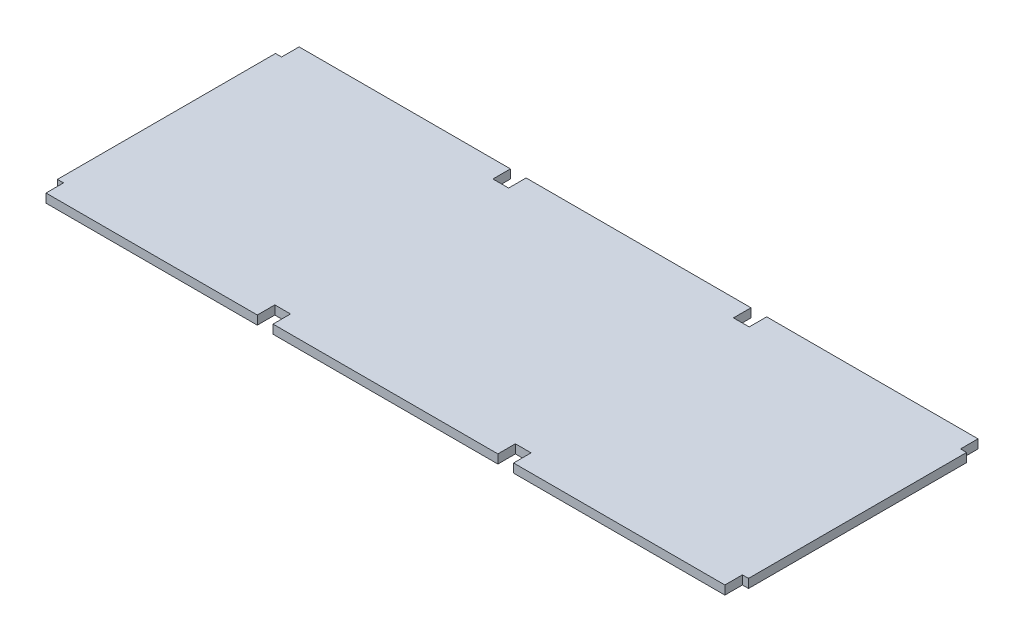
ISO-10303-21;
HEADER;
FILE_DESCRIPTION(('STEP AP214'),'2;1');
FILE_NAME('part.step','',(''),(''),'','','');
FILE_SCHEMA(('AUTOMOTIVE_DESIGN { 1 0 10303 214 1 1 1 1 }'));
ENDSEC;
DATA;
#1=APPLICATION_CONTEXT('core data for automotive mechanical design processes');
#2=APPLICATION_PROTOCOL_DEFINITION('international standard','automotive_design',2000,#1);
#3=PRODUCT_CONTEXT('',#1,'mechanical');
#4=PRODUCT('Part','Part','',(#3));
#5=PRODUCT_RELATED_PRODUCT_CATEGORY('part','',(#4));
#6=PRODUCT_DEFINITION_FORMATION('','',#4);
#7=PRODUCT_DEFINITION_CONTEXT('part definition',#1,'design');
#8=PRODUCT_DEFINITION('design','',#6,#7);
#9=PRODUCT_DEFINITION_SHAPE('','',#8);
#10=(LENGTH_UNIT() NAMED_UNIT(*) SI_UNIT(.MILLI.,.METRE.));
#11=(NAMED_UNIT(*) PLANE_ANGLE_UNIT() SI_UNIT($,.RADIAN.));
#12=(NAMED_UNIT(*) SI_UNIT($,.STERADIAN.) SOLID_ANGLE_UNIT());
#13=UNCERTAINTY_MEASURE_WITH_UNIT(LENGTH_MEASURE(1.E-05),#10,'distance_accuracy_value','');
#14=(GEOMETRIC_REPRESENTATION_CONTEXT(3) GLOBAL_UNCERTAINTY_ASSIGNED_CONTEXT((#13)) GLOBAL_UNIT_ASSIGNED_CONTEXT((#10,
#11,#12)) REPRESENTATION_CONTEXT('',''));
#15=CARTESIAN_POINT('',(0.,0.,0.));
#16=DIRECTION('',(0.,0.,1.));
#17=DIRECTION('',(1.,0.,0.));
#18=AXIS2_PLACEMENT_3D('',#15,#16,#17);
#19=CARTESIAN_POINT('',(2.7,3.9,0.));
#20=DIRECTION('',(0.,0.,-1.));
#21=DIRECTION('',(-1.,0.,0.));
#22=AXIS2_PLACEMENT_3D('',#19,#20,#21);
#23=PLANE('',#22);
#24=DIRECTION('',(1.,0.,0.));
#25=VECTOR('',#24,1.);
#26=CARTESIAN_POINT('',(2.7,0.,0.));
#27=LINE('',#26,#25);
#28=CARTESIAN_POINT('',(0.,0.,0.));
#29=VERTEX_POINT('',#28);
#30=CARTESIAN_POINT('',(2.7,0.,0.));
#31=VERTEX_POINT('',#30);
#32=EDGE_CURVE('E253',#29,#31,#27,.T.);
#33=ORIENTED_EDGE('',*,*,#32,.T.);
#34=DIRECTION('',(0.,-1.,0.));
#35=VECTOR('',#34,1.);
#36=CARTESIAN_POINT('',(2.7,3.9,0.));
#37=LINE('',#36,#35);
#38=CARTESIAN_POINT('',(2.7,3.9,0.));
#39=VERTEX_POINT('',#38);
#40=EDGE_CURVE('E11',#39,#31,#37,.T.);
#41=ORIENTED_EDGE('',*,*,#40,.F.);
#42=DIRECTION('',(1.,0.,0.));
#43=VECTOR('',#42,1.);
#44=CARTESIAN_POINT('',(2.7,3.9,0.));
#45=LINE('',#44,#43);
#46=CARTESIAN_POINT('',(0.,3.9,0.));
#47=VERTEX_POINT('',#46);
#48=EDGE_CURVE('E307',#47,#39,#45,.T.);
#49=ORIENTED_EDGE('',*,*,#48,.F.);
#50=DIRECTION('',(0.,-1.,0.));
#51=VECTOR('',#50,1.);
#52=CARTESIAN_POINT('',(0.,3.9,0.));
#53=LINE('',#52,#51);
#54=EDGE_CURVE('E249',#47,#29,#53,.T.);
#55=ORIENTED_EDGE('',*,*,#54,.T.);
#56=EDGE_LOOP('',(#33,#41,#49,#55));
#57=FACE_BOUND('',#56,.T.);
#58=ADVANCED_FACE('F37',(#57),#23,.F.);
#59=CARTESIAN_POINT('',(2.69999999999999,3.9,7.75000000000001));
#60=DIRECTION('',(1.,0.,0.));
#61=DIRECTION('',(0.,0.,-1.));
#62=AXIS2_PLACEMENT_3D('',#59,#60,#61);
#63=PLANE('',#62);
#64=DIRECTION('',(0.,0.,1.));
#65=VECTOR('',#64,1.);
#66=CARTESIAN_POINT('',(2.69999999999999,0.,7.75000000000001));
#67=LINE('',#66,#65);
#68=CARTESIAN_POINT('',(2.69999999999999,0.,7.75000000000001));
#69=VERTEX_POINT('',#68);
#70=EDGE_CURVE('E256',#31,#69,#67,.T.);
#71=ORIENTED_EDGE('',*,*,#70,.T.);
#72=DIRECTION('',(0.,-1.,0.));
#73=VECTOR('',#72,1.);
#74=CARTESIAN_POINT('',(2.69999999999999,3.9,7.75000000000001));
#75=LINE('',#74,#73);
#76=CARTESIAN_POINT('',(2.69999999999999,3.9,7.75000000000001));
#77=VERTEX_POINT('',#76);
#78=EDGE_CURVE('E45',#77,#69,#75,.T.);
#79=ORIENTED_EDGE('',*,*,#78,.F.);
#80=DIRECTION('',(0.,0.,1.));
#81=VECTOR('',#80,1.);
#82=CARTESIAN_POINT('',(2.69999999999999,3.9,7.75000000000001));
#83=LINE('',#82,#81);
#84=EDGE_CURVE('E156',#39,#77,#83,.T.);
#85=ORIENTED_EDGE('',*,*,#84,.F.);
#86=ORIENTED_EDGE('',*,*,#40,.T.);
#87=EDGE_LOOP('',(#71,#79,#85,#86));
#88=FACE_BOUND('',#87,.T.);
#89=ADVANCED_FACE('F465',(#88),#63,.F.);
#90=CARTESIAN_POINT('',(96.2,3.9,7.75));
#91=DIRECTION('',(0.,0.,-1.));
#92=DIRECTION('',(-1.,0.,0.));
#93=AXIS2_PLACEMENT_3D('',#90,#91,#92);
#94=PLANE('',#93);
#95=DIRECTION('',(1.,0.,0.));
#96=VECTOR('',#95,1.);
#97=CARTESIAN_POINT('',(96.2,0.,7.75));
#98=LINE('',#97,#96);
#99=CARTESIAN_POINT('',(96.2,0.,7.75));
#100=VERTEX_POINT('',#99);
#101=EDGE_CURVE('E258',#69,#100,#98,.T.);
#102=ORIENTED_EDGE('',*,*,#101,.T.);
#103=DIRECTION('',(0.,-1.,0.));
#104=VECTOR('',#103,1.);
#105=CARTESIAN_POINT('',(96.2,3.9,7.75));
#106=LINE('',#105,#104);
#107=CARTESIAN_POINT('',(96.2,3.9,7.75));
#108=VERTEX_POINT('',#107);
#109=EDGE_CURVE('E374',#108,#100,#106,.T.);
#110=ORIENTED_EDGE('',*,*,#109,.F.);
#111=DIRECTION('',(1.,0.,0.));
#112=VECTOR('',#111,1.);
#113=CARTESIAN_POINT('',(96.2,3.9,7.75));
#114=LINE('',#113,#112);
#115=EDGE_CURVE('E382',#77,#108,#114,.T.);
#116=ORIENTED_EDGE('',*,*,#115,.F.);
#117=ORIENTED_EDGE('',*,*,#78,.T.);
#118=EDGE_LOOP('',(#102,#110,#116,#117));
#119=FACE_BOUND('',#118,.T.);
#120=ADVANCED_FACE('F380',(#119),#94,.F.);
#121=CARTESIAN_POINT('',(96.2,3.9,0.));
#122=DIRECTION('',(-1.,0.,0.));
#123=DIRECTION('',(0.,0.,1.));
#124=AXIS2_PLACEMENT_3D('',#121,#122,#123);
#125=PLANE('',#124);
#126=DIRECTION('',(0.,0.,-1.));
#127=VECTOR('',#126,1.);
#128=CARTESIAN_POINT('',(96.2,0.,0.));
#129=LINE('',#128,#127);
#130=CARTESIAN_POINT('',(96.2,0.,0.));
#131=VERTEX_POINT('',#130);
#132=EDGE_CURVE('E260',#100,#131,#129,.T.);
#133=ORIENTED_EDGE('',*,*,#132,.T.);
#134=DIRECTION('',(0.,-1.,0.));
#135=VECTOR('',#134,1.);
#136=CARTESIAN_POINT('',(96.2,3.9,0.));
#137=LINE('',#136,#135);
#138=CARTESIAN_POINT('',(96.2,3.9,0.));
#139=VERTEX_POINT('',#138);
#140=EDGE_CURVE('E371',#139,#131,#137,.T.);
#141=ORIENTED_EDGE('',*,*,#140,.F.);
#142=DIRECTION('',(0.,0.,-1.));
#143=VECTOR('',#142,1.);
#144=CARTESIAN_POINT('',(96.2,3.9,0.));
#145=LINE('',#144,#143);
#146=EDGE_CURVE('E400',#108,#139,#145,.T.);
#147=ORIENTED_EDGE('',*,*,#146,.F.);
#148=ORIENTED_EDGE('',*,*,#109,.T.);
#149=EDGE_LOOP('',(#133,#141,#147,#148));
#150=FACE_BOUND('',#149,.T.);
#151=ADVANCED_FACE('F391',(#150),#125,.F.);
#152=CARTESIAN_POINT('',(103.15,3.9,0.));
#153=DIRECTION('',(0.,0.,-1.));
#154=DIRECTION('',(-1.,0.,0.));
#155=AXIS2_PLACEMENT_3D('',#152,#153,#154);
#156=PLANE('',#155);
#157=DIRECTION('',(1.,0.,0.));
#158=VECTOR('',#157,1.);
#159=CARTESIAN_POINT('',(103.15,0.,0.));
#160=LINE('',#159,#158);
#161=CARTESIAN_POINT('',(103.15,0.,0.));
#162=VERTEX_POINT('',#161);
#163=EDGE_CURVE('E262',#131,#162,#160,.T.);
#164=ORIENTED_EDGE('',*,*,#163,.T.);
#165=DIRECTION('',(0.,-1.,0.));
#166=VECTOR('',#165,1.);
#167=CARTESIAN_POINT('',(103.15,3.9,0.));
#168=LINE('',#167,#166);
#169=CARTESIAN_POINT('',(103.15,3.9,0.));
#170=VERTEX_POINT('',#169);
#171=EDGE_CURVE('E368',#170,#162,#168,.T.);
#172=ORIENTED_EDGE('',*,*,#171,.F.);
#173=DIRECTION('',(1.,0.,0.));
#174=VECTOR('',#173,1.);
#175=CARTESIAN_POINT('',(103.15,3.9,0.));
#176=LINE('',#175,#174);
#177=EDGE_CURVE('E397',#139,#170,#176,.T.);
#178=ORIENTED_EDGE('',*,*,#177,.F.);
#179=ORIENTED_EDGE('',*,*,#140,.T.);
#180=EDGE_LOOP('',(#164,#172,#178,#179));
#181=FACE_BOUND('',#180,.T.);
#182=ADVANCED_FACE('F395',(#181),#156,.F.);
#183=CARTESIAN_POINT('',(103.15,3.9,7.75));
#184=DIRECTION('',(1.,0.,0.));
#185=DIRECTION('',(0.,0.,-1.));
#186=AXIS2_PLACEMENT_3D('',#183,#184,#185);
#187=PLANE('',#186);
#188=DIRECTION('',(0.,0.,1.));
#189=VECTOR('',#188,1.);
#190=CARTESIAN_POINT('',(103.15,0.,7.75));
#191=LINE('',#190,#189);
#192=CARTESIAN_POINT('',(103.15,0.,7.75));
#193=VERTEX_POINT('',#192);
#194=EDGE_CURVE('E264',#162,#193,#191,.T.);
#195=ORIENTED_EDGE('',*,*,#194,.T.);
#196=DIRECTION('',(0.,-1.,0.));
#197=VECTOR('',#196,1.);
#198=CARTESIAN_POINT('',(103.15,3.9,7.75));
#199=LINE('',#198,#197);
#200=CARTESIAN_POINT('',(103.15,3.9,7.75));
#201=VERTEX_POINT('',#200);
#202=EDGE_CURVE('E365',#201,#193,#199,.T.);
#203=ORIENTED_EDGE('',*,*,#202,.F.);
#204=DIRECTION('',(0.,0.,1.));
#205=VECTOR('',#204,1.);
#206=CARTESIAN_POINT('',(103.15,3.9,7.75));
#207=LINE('',#206,#205);
#208=EDGE_CURVE('E399',#170,#201,#207,.T.);
#209=ORIENTED_EDGE('',*,*,#208,.F.);
#210=ORIENTED_EDGE('',*,*,#171,.T.);
#211=EDGE_LOOP('',(#195,#203,#209,#210));
#212=FACE_BOUND('',#211,.T.);
#213=ADVANCED_FACE('F478',(#212),#187,.F.);
#214=CARTESIAN_POINT('',(202.65,3.9,7.74999999999998));
#215=DIRECTION('',(0.,0.,-1.));
#216=DIRECTION('',(-1.,0.,0.));
#217=AXIS2_PLACEMENT_3D('',#214,#215,#216);
#218=PLANE('',#217);
#219=DIRECTION('',(1.,0.,0.));
#220=VECTOR('',#219,1.);
#221=CARTESIAN_POINT('',(202.65,0.,7.74999999999998));
#222=LINE('',#221,#220);
#223=CARTESIAN_POINT('',(202.65,0.,7.74999999999998));
#224=VERTEX_POINT('',#223);
#225=EDGE_CURVE('E266',#193,#224,#222,.T.);
#226=ORIENTED_EDGE('',*,*,#225,.T.);
#227=DIRECTION('',(0.,-1.,0.));
#228=VECTOR('',#227,1.);
#229=CARTESIAN_POINT('',(202.65,3.9,7.74999999999998));
#230=LINE('',#229,#228);
#231=CARTESIAN_POINT('',(202.65,3.9,7.74999999999998));
#232=VERTEX_POINT('',#231);
#233=EDGE_CURVE('E362',#232,#224,#230,.T.);
#234=ORIENTED_EDGE('',*,*,#233,.F.);
#235=DIRECTION('',(1.,0.,0.));
#236=VECTOR('',#235,1.);
#237=CARTESIAN_POINT('',(202.65,3.9,7.74999999999998));
#238=LINE('',#237,#236);
#239=EDGE_CURVE('E402',#201,#232,#238,.T.);
#240=ORIENTED_EDGE('',*,*,#239,.F.);
#241=ORIENTED_EDGE('',*,*,#202,.T.);
#242=EDGE_LOOP('',(#226,#234,#240,#241));
#243=FACE_BOUND('',#242,.T.);
#244=ADVANCED_FACE('F481',(#243),#218,.F.);
#245=CARTESIAN_POINT('',(202.65,3.9,0.));
#246=DIRECTION('',(-1.,0.,0.));
#247=DIRECTION('',(0.,0.,1.));
#248=AXIS2_PLACEMENT_3D('',#245,#246,#247);
#249=PLANE('',#248);
#250=DIRECTION('',(0.,0.,-1.));
#251=VECTOR('',#250,1.);
#252=CARTESIAN_POINT('',(202.65,0.,0.));
#253=LINE('',#252,#251);
#254=CARTESIAN_POINT('',(202.65,0.,0.));
#255=VERTEX_POINT('',#254);
#256=EDGE_CURVE('E268',#224,#255,#253,.T.);
#257=ORIENTED_EDGE('',*,*,#256,.T.);
#258=DIRECTION('',(0.,-1.,0.));
#259=VECTOR('',#258,1.);
#260=CARTESIAN_POINT('',(202.65,3.9,0.));
#261=LINE('',#260,#259);
#262=CARTESIAN_POINT('',(202.65,3.9,0.));
#263=VERTEX_POINT('',#262);
#264=EDGE_CURVE('E359',#263,#255,#261,.T.);
#265=ORIENTED_EDGE('',*,*,#264,.F.);
#266=DIRECTION('',(0.,0.,-1.));
#267=VECTOR('',#266,1.);
#268=CARTESIAN_POINT('',(202.65,3.9,0.));
#269=LINE('',#268,#267);
#270=EDGE_CURVE('E408',#232,#263,#269,.T.);
#271=ORIENTED_EDGE('',*,*,#270,.F.);
#272=ORIENTED_EDGE('',*,*,#233,.T.);
#273=EDGE_LOOP('',(#257,#265,#271,#272));
#274=FACE_BOUND('',#273,.T.);
#275=ADVANCED_FACE('F485',(#274),#249,.F.);
#276=CARTESIAN_POINT('',(209.6,3.9,0.));
#277=DIRECTION('',(0.,0.,-1.));
#278=DIRECTION('',(-1.,0.,0.));
#279=AXIS2_PLACEMENT_3D('',#276,#277,#278);
#280=PLANE('',#279);
#281=DIRECTION('',(1.,0.,0.));
#282=VECTOR('',#281,1.);
#283=CARTESIAN_POINT('',(209.6,0.,0.));
#284=LINE('',#283,#282);
#285=CARTESIAN_POINT('',(209.6,0.,0.));
#286=VERTEX_POINT('',#285);
#287=EDGE_CURVE('E270',#255,#286,#284,.T.);
#288=ORIENTED_EDGE('',*,*,#287,.T.);
#289=DIRECTION('',(0.,-1.,0.));
#290=VECTOR('',#289,1.);
#291=CARTESIAN_POINT('',(209.6,3.9,0.));
#292=LINE('',#291,#290);
#293=CARTESIAN_POINT('',(209.6,3.9,0.));
#294=VERTEX_POINT('',#293);
#295=EDGE_CURVE('E356',#294,#286,#292,.T.);
#296=ORIENTED_EDGE('',*,*,#295,.F.);
#297=DIRECTION('',(1.,0.,0.));
#298=VECTOR('',#297,1.);
#299=CARTESIAN_POINT('',(209.6,3.9,0.));
#300=LINE('',#299,#298);
#301=EDGE_CURVE('E410',#263,#294,#300,.T.);
#302=ORIENTED_EDGE('',*,*,#301,.F.);
#303=ORIENTED_EDGE('',*,*,#264,.T.);
#304=EDGE_LOOP('',(#288,#296,#302,#303));
#305=FACE_BOUND('',#304,.T.);
#306=ADVANCED_FACE('F489',(#305),#280,.F.);
#307=CARTESIAN_POINT('',(209.6,3.9,7.75));
#308=DIRECTION('',(1.,0.,0.));
#309=DIRECTION('',(0.,0.,-1.));
#310=AXIS2_PLACEMENT_3D('',#307,#308,#309);
#311=PLANE('',#310);
#312=DIRECTION('',(0.,0.,1.));
#313=VECTOR('',#312,1.);
#314=CARTESIAN_POINT('',(209.6,0.,7.75));
#315=LINE('',#314,#313);
#316=CARTESIAN_POINT('',(209.6,0.,7.75));
#317=VERTEX_POINT('',#316);
#318=EDGE_CURVE('E272',#286,#317,#315,.T.);
#319=ORIENTED_EDGE('',*,*,#318,.T.);
#320=DIRECTION('',(0.,-1.,0.));
#321=VECTOR('',#320,1.);
#322=CARTESIAN_POINT('',(209.6,3.9,7.75));
#323=LINE('',#322,#321);
#324=CARTESIAN_POINT('',(209.6,3.9,7.75));
#325=VERTEX_POINT('',#324);
#326=EDGE_CURVE('E353',#325,#317,#323,.T.);
#327=ORIENTED_EDGE('',*,*,#326,.F.);
#328=DIRECTION('',(0.,0.,1.));
#329=VECTOR('',#328,1.);
#330=CARTESIAN_POINT('',(209.6,3.9,7.75));
#331=LINE('',#330,#329);
#332=EDGE_CURVE('E412',#294,#325,#331,.T.);
#333=ORIENTED_EDGE('',*,*,#332,.F.);
#334=ORIENTED_EDGE('',*,*,#295,.T.);
#335=EDGE_LOOP('',(#319,#327,#333,#334));
#336=FACE_BOUND('',#335,.T.);
#337=ADVANCED_FACE('F493',(#336),#311,.F.);
#338=CARTESIAN_POINT('',(303.1,3.9,7.75));
#339=DIRECTION('',(0.,0.,-1.));
#340=DIRECTION('',(-1.,0.,0.));
#341=AXIS2_PLACEMENT_3D('',#338,#339,#340);
#342=PLANE('',#341);
#343=DIRECTION('',(1.,0.,0.));
#344=VECTOR('',#343,1.);
#345=CARTESIAN_POINT('',(303.1,0.,7.75));
#346=LINE('',#345,#344);
#347=CARTESIAN_POINT('',(303.1,0.,7.75));
#348=VERTEX_POINT('',#347);
#349=EDGE_CURVE('E274',#317,#348,#346,.T.);
#350=ORIENTED_EDGE('',*,*,#349,.T.);
#351=DIRECTION('',(0.,-1.,0.));
#352=VECTOR('',#351,1.);
#353=CARTESIAN_POINT('',(303.1,3.9,7.75));
#354=LINE('',#353,#352);
#355=CARTESIAN_POINT('',(303.1,3.9,7.75));
#356=VERTEX_POINT('',#355);
#357=EDGE_CURVE('E350',#356,#348,#354,.T.);
#358=ORIENTED_EDGE('',*,*,#357,.F.);
#359=DIRECTION('',(1.,0.,0.));
#360=VECTOR('',#359,1.);
#361=CARTESIAN_POINT('',(303.1,3.9,7.75));
#362=LINE('',#361,#360);
#363=EDGE_CURVE('E414',#325,#356,#362,.T.);
#364=ORIENTED_EDGE('',*,*,#363,.F.);
#365=ORIENTED_EDGE('',*,*,#326,.T.);
#366=EDGE_LOOP('',(#350,#358,#364,#365));
#367=FACE_BOUND('',#366,.T.);
#368=ADVANCED_FACE('F497',(#367),#342,.F.);
#369=CARTESIAN_POINT('',(303.1,3.9,0.));
#370=DIRECTION('',(-1.,0.,0.));
#371=DIRECTION('',(0.,0.,1.));
#372=AXIS2_PLACEMENT_3D('',#369,#370,#371);
#373=PLANE('',#372);
#374=DIRECTION('',(0.,0.,-1.));
#375=VECTOR('',#374,1.);
#376=CARTESIAN_POINT('',(303.1,0.,0.));
#377=LINE('',#376,#375);
#378=CARTESIAN_POINT('',(303.1,0.,0.));
#379=VERTEX_POINT('',#378);
#380=EDGE_CURVE('E276',#348,#379,#377,.T.);
#381=ORIENTED_EDGE('',*,*,#380,.T.);
#382=DIRECTION('',(0.,-1.,0.));
#383=VECTOR('',#382,1.);
#384=CARTESIAN_POINT('',(303.1,3.9,0.));
#385=LINE('',#384,#383);
#386=CARTESIAN_POINT('',(303.1,3.9,0.));
#387=VERTEX_POINT('',#386);
#388=EDGE_CURVE('E347',#387,#379,#385,.T.);
#389=ORIENTED_EDGE('',*,*,#388,.F.);
#390=DIRECTION('',(0.,0.,-1.));
#391=VECTOR('',#390,1.);
#392=CARTESIAN_POINT('',(303.1,3.9,0.));
#393=LINE('',#392,#391);
#394=EDGE_CURVE('E416',#356,#387,#393,.T.);
#395=ORIENTED_EDGE('',*,*,#394,.F.);
#396=ORIENTED_EDGE('',*,*,#357,.T.);
#397=EDGE_LOOP('',(#381,#389,#395,#396));
#398=FACE_BOUND('',#397,.T.);
#399=ADVANCED_FACE('F501',(#398),#373,.F.);
#400=CARTESIAN_POINT('',(305.8,3.9,0.));
#401=DIRECTION('',(0.,0.,-1.));
#402=DIRECTION('',(-1.,0.,0.));
#403=AXIS2_PLACEMENT_3D('',#400,#401,#402);
#404=PLANE('',#403);
#405=DIRECTION('',(1.,0.,0.));
#406=VECTOR('',#405,1.);
#407=CARTESIAN_POINT('',(305.8,0.,0.));
#408=LINE('',#407,#406);
#409=CARTESIAN_POINT('',(305.8,0.,0.));
#410=VERTEX_POINT('',#409);
#411=EDGE_CURVE('E278',#379,#410,#408,.T.);
#412=ORIENTED_EDGE('',*,*,#411,.T.);
#413=DIRECTION('',(0.,-1.,0.));
#414=VECTOR('',#413,1.);
#415=CARTESIAN_POINT('',(305.8,3.9,0.));
#416=LINE('',#415,#414);
#417=CARTESIAN_POINT('',(305.8,3.9,0.));
#418=VERTEX_POINT('',#417);
#419=EDGE_CURVE('E344',#418,#410,#416,.T.);
#420=ORIENTED_EDGE('',*,*,#419,.F.);
#421=DIRECTION('',(1.,0.,0.));
#422=VECTOR('',#421,1.);
#423=CARTESIAN_POINT('',(305.8,3.9,0.));
#424=LINE('',#423,#422);
#425=EDGE_CURVE('E418',#387,#418,#424,.T.);
#426=ORIENTED_EDGE('',*,*,#425,.F.);
#427=ORIENTED_EDGE('',*,*,#388,.T.);
#428=EDGE_LOOP('',(#412,#420,#426,#427));
#429=FACE_BOUND('',#428,.T.);
#430=ADVANCED_FACE('F505',(#429),#404,.F.);
#431=CARTESIAN_POINT('',(305.8,3.9,-96.5));
#432=DIRECTION('',(-1.,0.,0.));
#433=DIRECTION('',(0.,0.,1.));
#434=AXIS2_PLACEMENT_3D('',#431,#432,#433);
#435=PLANE('',#434);
#436=DIRECTION('',(0.,0.,-1.));
#437=VECTOR('',#436,1.);
#438=CARTESIAN_POINT('',(305.8,0.,-96.5));
#439=LINE('',#438,#437);
#440=CARTESIAN_POINT('',(305.8,0.,-96.5));
#441=VERTEX_POINT('',#440);
#442=EDGE_CURVE('E280',#410,#441,#439,.T.);
#443=ORIENTED_EDGE('',*,*,#442,.T.);
#444=DIRECTION('',(0.,-1.,0.));
#445=VECTOR('',#444,1.);
#446=CARTESIAN_POINT('',(305.8,3.9,-96.5));
#447=LINE('',#446,#445);
#448=CARTESIAN_POINT('',(305.8,3.9,-96.5));
#449=VERTEX_POINT('',#448);
#450=EDGE_CURVE('E341',#449,#441,#447,.T.);
#451=ORIENTED_EDGE('',*,*,#450,.F.);
#452=DIRECTION('',(0.,0.,-1.));
#453=VECTOR('',#452,1.);
#454=CARTESIAN_POINT('',(305.8,3.9,-96.5));
#455=LINE('',#454,#453);
#456=EDGE_CURVE('E420',#418,#449,#455,.T.);
#457=ORIENTED_EDGE('',*,*,#456,.F.);
#458=ORIENTED_EDGE('',*,*,#419,.T.);
#459=EDGE_LOOP('',(#443,#451,#457,#458));
#460=FACE_BOUND('',#459,.T.);
#461=ADVANCED_FACE('F509',(#460),#435,.F.);
#462=CARTESIAN_POINT('',(303.1,3.9,-96.5));
#463=DIRECTION('',(0.,0.,1.));
#464=DIRECTION('',(1.,0.,0.));
#465=AXIS2_PLACEMENT_3D('',#462,#463,#464);
#466=PLANE('',#465);
#467=DIRECTION('',(-1.,0.,0.));
#468=VECTOR('',#467,1.);
#469=CARTESIAN_POINT('',(303.1,0.,-96.5));
#470=LINE('',#469,#468);
#471=CARTESIAN_POINT('',(303.1,0.,-96.5));
#472=VERTEX_POINT('',#471);
#473=EDGE_CURVE('E282',#441,#472,#470,.T.);
#474=ORIENTED_EDGE('',*,*,#473,.T.);
#475=DIRECTION('',(0.,-1.,0.));
#476=VECTOR('',#475,1.);
#477=CARTESIAN_POINT('',(303.1,3.9,-96.5));
#478=LINE('',#477,#476);
#479=CARTESIAN_POINT('',(303.1,3.9,-96.5));
#480=VERTEX_POINT('',#479);
#481=EDGE_CURVE('E338',#480,#472,#478,.T.);
#482=ORIENTED_EDGE('',*,*,#481,.F.);
#483=DIRECTION('',(-1.,0.,0.));
#484=VECTOR('',#483,1.);
#485=CARTESIAN_POINT('',(303.1,3.9,-96.5));
#486=LINE('',#485,#484);
#487=EDGE_CURVE('E422',#449,#480,#486,.T.);
#488=ORIENTED_EDGE('',*,*,#487,.F.);
#489=ORIENTED_EDGE('',*,*,#450,.T.);
#490=EDGE_LOOP('',(#474,#482,#488,#489));
#491=FACE_BOUND('',#490,.T.);
#492=ADVANCED_FACE('F513',(#491),#466,.F.);
#493=CARTESIAN_POINT('',(303.1,3.9,-104.25));
#494=DIRECTION('',(-1.,0.,0.));
#495=DIRECTION('',(0.,0.,1.));
#496=AXIS2_PLACEMENT_3D('',#493,#494,#495);
#497=PLANE('',#496);
#498=DIRECTION('',(0.,0.,-1.));
#499=VECTOR('',#498,1.);
#500=CARTESIAN_POINT('',(303.1,0.,-104.25));
#501=LINE('',#500,#499);
#502=CARTESIAN_POINT('',(303.1,0.,-104.25));
#503=VERTEX_POINT('',#502);
#504=EDGE_CURVE('E284',#472,#503,#501,.T.);
#505=ORIENTED_EDGE('',*,*,#504,.T.);
#506=DIRECTION('',(0.,-1.,0.));
#507=VECTOR('',#506,1.);
#508=CARTESIAN_POINT('',(303.1,3.9,-104.25));
#509=LINE('',#508,#507);
#510=CARTESIAN_POINT('',(303.1,3.9,-104.25));
#511=VERTEX_POINT('',#510);
#512=EDGE_CURVE('E335',#511,#503,#509,.T.);
#513=ORIENTED_EDGE('',*,*,#512,.F.);
#514=DIRECTION('',(0.,0.,-1.));
#515=VECTOR('',#514,1.);
#516=CARTESIAN_POINT('',(303.1,3.9,-104.25));
#517=LINE('',#516,#515);
#518=EDGE_CURVE('E424',#480,#511,#517,.T.);
#519=ORIENTED_EDGE('',*,*,#518,.F.);
#520=ORIENTED_EDGE('',*,*,#481,.T.);
#521=EDGE_LOOP('',(#505,#513,#519,#520));
#522=FACE_BOUND('',#521,.T.);
#523=ADVANCED_FACE('F517',(#522),#497,.F.);
#524=CARTESIAN_POINT('',(209.6,3.9,-104.25));
#525=DIRECTION('',(0.,0.,1.));
#526=DIRECTION('',(1.,0.,0.));
#527=AXIS2_PLACEMENT_3D('',#524,#525,#526);
#528=PLANE('',#527);
#529=DIRECTION('',(-1.,0.,0.));
#530=VECTOR('',#529,1.);
#531=CARTESIAN_POINT('',(209.6,0.,-104.25));
#532=LINE('',#531,#530);
#533=CARTESIAN_POINT('',(209.6,0.,-104.25));
#534=VERTEX_POINT('',#533);
#535=EDGE_CURVE('E286',#503,#534,#532,.T.);
#536=ORIENTED_EDGE('',*,*,#535,.T.);
#537=DIRECTION('',(0.,-1.,0.));
#538=VECTOR('',#537,1.);
#539=CARTESIAN_POINT('',(209.6,3.9,-104.25));
#540=LINE('',#539,#538);
#541=CARTESIAN_POINT('',(209.6,3.9,-104.25));
#542=VERTEX_POINT('',#541);
#543=EDGE_CURVE('E332',#542,#534,#540,.T.);
#544=ORIENTED_EDGE('',*,*,#543,.F.);
#545=DIRECTION('',(-1.,0.,0.));
#546=VECTOR('',#545,1.);
#547=CARTESIAN_POINT('',(209.6,3.9,-104.25));
#548=LINE('',#547,#546);
#549=EDGE_CURVE('E426',#511,#542,#548,.T.);
#550=ORIENTED_EDGE('',*,*,#549,.F.);
#551=ORIENTED_EDGE('',*,*,#512,.T.);
#552=EDGE_LOOP('',(#536,#544,#550,#551));
#553=FACE_BOUND('',#552,.T.);
#554=ADVANCED_FACE('F521',(#553),#528,.F.);
#555=CARTESIAN_POINT('',(209.6,3.9,-96.5));
#556=DIRECTION('',(1.,0.,0.));
#557=DIRECTION('',(0.,0.,-1.));
#558=AXIS2_PLACEMENT_3D('',#555,#556,#557);
#559=PLANE('',#558);
#560=DIRECTION('',(0.,0.,1.));
#561=VECTOR('',#560,1.);
#562=CARTESIAN_POINT('',(209.6,0.,-96.5));
#563=LINE('',#562,#561);
#564=CARTESIAN_POINT('',(209.6,0.,-96.5));
#565=VERTEX_POINT('',#564);
#566=EDGE_CURVE('E288',#534,#565,#563,.T.);
#567=ORIENTED_EDGE('',*,*,#566,.T.);
#568=DIRECTION('',(0.,-1.,0.));
#569=VECTOR('',#568,1.);
#570=CARTESIAN_POINT('',(209.6,3.9,-96.5));
#571=LINE('',#570,#569);
#572=CARTESIAN_POINT('',(209.6,3.9,-96.5));
#573=VERTEX_POINT('',#572);
#574=EDGE_CURVE('E329',#573,#565,#571,.T.);
#575=ORIENTED_EDGE('',*,*,#574,.F.);
#576=DIRECTION('',(0.,0.,1.));
#577=VECTOR('',#576,1.);
#578=CARTESIAN_POINT('',(209.6,3.9,-96.5));
#579=LINE('',#578,#577);
#580=EDGE_CURVE('E428',#542,#573,#579,.T.);
#581=ORIENTED_EDGE('',*,*,#580,.F.);
#582=ORIENTED_EDGE('',*,*,#543,.T.);
#583=EDGE_LOOP('',(#567,#575,#581,#582));
#584=FACE_BOUND('',#583,.T.);
#585=ADVANCED_FACE('F525',(#584),#559,.F.);
#586=CARTESIAN_POINT('',(202.65,3.9,-96.5));
#587=DIRECTION('',(0.,0.,1.));
#588=DIRECTION('',(1.,0.,0.));
#589=AXIS2_PLACEMENT_3D('',#586,#587,#588);
#590=PLANE('',#589);
#591=DIRECTION('',(-1.,0.,0.));
#592=VECTOR('',#591,1.);
#593=CARTESIAN_POINT('',(202.65,0.,-96.5));
#594=LINE('',#593,#592);
#595=CARTESIAN_POINT('',(202.65,0.,-96.5));
#596=VERTEX_POINT('',#595);
#597=EDGE_CURVE('E290',#565,#596,#594,.T.);
#598=ORIENTED_EDGE('',*,*,#597,.T.);
#599=DIRECTION('',(0.,-1.,0.));
#600=VECTOR('',#599,1.);
#601=CARTESIAN_POINT('',(202.65,3.9,-96.5));
#602=LINE('',#601,#600);
#603=CARTESIAN_POINT('',(202.65,3.9,-96.5));
#604=VERTEX_POINT('',#603);
#605=EDGE_CURVE('E326',#604,#596,#602,.T.);
#606=ORIENTED_EDGE('',*,*,#605,.F.);
#607=DIRECTION('',(-1.,0.,0.));
#608=VECTOR('',#607,1.);
#609=CARTESIAN_POINT('',(202.65,3.9,-96.5));
#610=LINE('',#609,#608);
#611=EDGE_CURVE('E430',#573,#604,#610,.T.);
#612=ORIENTED_EDGE('',*,*,#611,.F.);
#613=ORIENTED_EDGE('',*,*,#574,.T.);
#614=EDGE_LOOP('',(#598,#606,#612,#613));
#615=FACE_BOUND('',#614,.T.);
#616=ADVANCED_FACE('F529',(#615),#590,.F.);
#617=CARTESIAN_POINT('',(202.65,3.9,-104.25));
#618=DIRECTION('',(-1.,0.,0.));
#619=DIRECTION('',(0.,0.,1.));
#620=AXIS2_PLACEMENT_3D('',#617,#618,#619);
#621=PLANE('',#620);
#622=DIRECTION('',(0.,0.,-1.));
#623=VECTOR('',#622,1.);
#624=CARTESIAN_POINT('',(202.65,0.,-104.25));
#625=LINE('',#624,#623);
#626=CARTESIAN_POINT('',(202.65,0.,-104.25));
#627=VERTEX_POINT('',#626);
#628=EDGE_CURVE('E292',#596,#627,#625,.T.);
#629=ORIENTED_EDGE('',*,*,#628,.T.);
#630=DIRECTION('',(0.,-1.,0.));
#631=VECTOR('',#630,1.);
#632=CARTESIAN_POINT('',(202.65,3.9,-104.25));
#633=LINE('',#632,#631);
#634=CARTESIAN_POINT('',(202.65,3.9,-104.25));
#635=VERTEX_POINT('',#634);
#636=EDGE_CURVE('E323',#635,#627,#633,.T.);
#637=ORIENTED_EDGE('',*,*,#636,.F.);
#638=DIRECTION('',(0.,0.,-1.));
#639=VECTOR('',#638,1.);
#640=CARTESIAN_POINT('',(202.65,3.9,-104.25));
#641=LINE('',#640,#639);
#642=EDGE_CURVE('E432',#604,#635,#641,.T.);
#643=ORIENTED_EDGE('',*,*,#642,.F.);
#644=ORIENTED_EDGE('',*,*,#605,.T.);
#645=EDGE_LOOP('',(#629,#637,#643,#644));
#646=FACE_BOUND('',#645,.T.);
#647=ADVANCED_FACE('F533',(#646),#621,.F.);
#648=CARTESIAN_POINT('',(103.15,3.9,-104.25));
#649=DIRECTION('',(0.,0.,1.));
#650=DIRECTION('',(1.,0.,0.));
#651=AXIS2_PLACEMENT_3D('',#648,#649,#650);
#652=PLANE('',#651);
#653=DIRECTION('',(-1.,0.,0.));
#654=VECTOR('',#653,1.);
#655=CARTESIAN_POINT('',(103.15,0.,-104.25));
#656=LINE('',#655,#654);
#657=CARTESIAN_POINT('',(103.15,0.,-104.25));
#658=VERTEX_POINT('',#657);
#659=EDGE_CURVE('E294',#627,#658,#656,.T.);
#660=ORIENTED_EDGE('',*,*,#659,.T.);
#661=DIRECTION('',(0.,-1.,0.));
#662=VECTOR('',#661,1.);
#663=CARTESIAN_POINT('',(103.15,3.9,-104.25));
#664=LINE('',#663,#662);
#665=CARTESIAN_POINT('',(103.15,3.9,-104.25));
#666=VERTEX_POINT('',#665);
#667=EDGE_CURVE('E320',#666,#658,#664,.T.);
#668=ORIENTED_EDGE('',*,*,#667,.F.);
#669=DIRECTION('',(-1.,0.,0.));
#670=VECTOR('',#669,1.);
#671=CARTESIAN_POINT('',(103.15,3.9,-104.25));
#672=LINE('',#671,#670);
#673=EDGE_CURVE('E434',#635,#666,#672,.T.);
#674=ORIENTED_EDGE('',*,*,#673,.F.);
#675=ORIENTED_EDGE('',*,*,#636,.T.);
#676=EDGE_LOOP('',(#660,#668,#674,#675));
#677=FACE_BOUND('',#676,.T.);
#678=ADVANCED_FACE('F537',(#677),#652,.F.);
#679=CARTESIAN_POINT('',(103.15,3.9,-96.5));
#680=DIRECTION('',(1.,0.,0.));
#681=DIRECTION('',(0.,0.,-1.));
#682=AXIS2_PLACEMENT_3D('',#679,#680,#681);
#683=PLANE('',#682);
#684=DIRECTION('',(0.,0.,1.));
#685=VECTOR('',#684,1.);
#686=CARTESIAN_POINT('',(103.15,0.,-96.5));
#687=LINE('',#686,#685);
#688=CARTESIAN_POINT('',(103.15,0.,-96.5));
#689=VERTEX_POINT('',#688);
#690=EDGE_CURVE('E296',#658,#689,#687,.T.);
#691=ORIENTED_EDGE('',*,*,#690,.T.);
#692=DIRECTION('',(0.,-1.,0.));
#693=VECTOR('',#692,1.);
#694=CARTESIAN_POINT('',(103.15,3.9,-96.5));
#695=LINE('',#694,#693);
#696=CARTESIAN_POINT('',(103.15,3.9,-96.5));
#697=VERTEX_POINT('',#696);
#698=EDGE_CURVE('E317',#697,#689,#695,.T.);
#699=ORIENTED_EDGE('',*,*,#698,.F.);
#700=DIRECTION('',(0.,0.,1.));
#701=VECTOR('',#700,1.);
#702=CARTESIAN_POINT('',(103.15,3.9,-96.5));
#703=LINE('',#702,#701);
#704=EDGE_CURVE('E436',#666,#697,#703,.T.);
#705=ORIENTED_EDGE('',*,*,#704,.F.);
#706=ORIENTED_EDGE('',*,*,#667,.T.);
#707=EDGE_LOOP('',(#691,#699,#705,#706));
#708=FACE_BOUND('',#707,.T.);
#709=ADVANCED_FACE('F541',(#708),#683,.F.);
#710=CARTESIAN_POINT('',(96.2,3.9,-96.5));
#711=DIRECTION('',(0.,0.,1.));
#712=DIRECTION('',(1.,0.,0.));
#713=AXIS2_PLACEMENT_3D('',#710,#711,#712);
#714=PLANE('',#713);
#715=DIRECTION('',(-1.,0.,0.));
#716=VECTOR('',#715,1.);
#717=CARTESIAN_POINT('',(96.2,0.,-96.5));
#718=LINE('',#717,#716);
#719=CARTESIAN_POINT('',(96.2,0.,-96.5));
#720=VERTEX_POINT('',#719);
#721=EDGE_CURVE('E298',#689,#720,#718,.T.);
#722=ORIENTED_EDGE('',*,*,#721,.T.);
#723=DIRECTION('',(0.,-1.,0.));
#724=VECTOR('',#723,1.);
#725=CARTESIAN_POINT('',(96.2,3.9,-96.5));
#726=LINE('',#725,#724);
#727=CARTESIAN_POINT('',(96.2,3.9,-96.5));
#728=VERTEX_POINT('',#727);
#729=EDGE_CURVE('E314',#728,#720,#726,.T.);
#730=ORIENTED_EDGE('',*,*,#729,.F.);
#731=DIRECTION('',(-1.,0.,0.));
#732=VECTOR('',#731,1.);
#733=CARTESIAN_POINT('',(96.2,3.9,-96.5));
#734=LINE('',#733,#732);
#735=EDGE_CURVE('E438',#697,#728,#734,.T.);
#736=ORIENTED_EDGE('',*,*,#735,.F.);
#737=ORIENTED_EDGE('',*,*,#698,.T.);
#738=EDGE_LOOP('',(#722,#730,#736,#737));
#739=FACE_BOUND('',#738,.T.);
#740=ADVANCED_FACE('F545',(#739),#714,.F.);
#741=CARTESIAN_POINT('',(96.2,3.9,-104.25));
#742=DIRECTION('',(-1.,0.,0.));
#743=DIRECTION('',(0.,0.,1.));
#744=AXIS2_PLACEMENT_3D('',#741,#742,#743);
#745=PLANE('',#744);
#746=DIRECTION('',(0.,0.,-1.));
#747=VECTOR('',#746,1.);
#748=CARTESIAN_POINT('',(96.2,0.,-104.25));
#749=LINE('',#748,#747);
#750=CARTESIAN_POINT('',(96.2,0.,-104.25));
#751=VERTEX_POINT('',#750);
#752=EDGE_CURVE('E300',#720,#751,#749,.T.);
#753=ORIENTED_EDGE('',*,*,#752,.T.);
#754=DIRECTION('',(0.,-1.,0.));
#755=VECTOR('',#754,1.);
#756=CARTESIAN_POINT('',(96.2,3.9,-104.25));
#757=LINE('',#756,#755);
#758=CARTESIAN_POINT('',(96.2,3.9,-104.25));
#759=VERTEX_POINT('',#758);
#760=EDGE_CURVE('E311',#759,#751,#757,.T.);
#761=ORIENTED_EDGE('',*,*,#760,.F.);
#762=DIRECTION('',(0.,0.,-1.));
#763=VECTOR('',#762,1.);
#764=CARTESIAN_POINT('',(96.2,3.9,-104.25));
#765=LINE('',#764,#763);
#766=EDGE_CURVE('E440',#728,#759,#765,.T.);
#767=ORIENTED_EDGE('',*,*,#766,.F.);
#768=ORIENTED_EDGE('',*,*,#729,.T.);
#769=EDGE_LOOP('',(#753,#761,#767,#768));
#770=FACE_BOUND('',#769,.T.);
#771=ADVANCED_FACE('F446',(#770),#745,.F.);
#772=CARTESIAN_POINT('',(2.69999999999999,3.9,-104.25));
#773=DIRECTION('',(0.,0.,1.));
#774=DIRECTION('',(1.,0.,0.));
#775=AXIS2_PLACEMENT_3D('',#772,#773,#774);
#776=PLANE('',#775);
#777=DIRECTION('',(-1.,0.,0.));
#778=VECTOR('',#777,1.);
#779=CARTESIAN_POINT('',(2.69999999999999,0.,-104.25));
#780=LINE('',#779,#778);
#781=CARTESIAN_POINT('',(2.69999999999999,0.,-104.25));
#782=VERTEX_POINT('',#781);
#783=EDGE_CURVE('E302',#751,#782,#780,.T.);
#784=ORIENTED_EDGE('',*,*,#783,.T.);
#785=DIRECTION('',(0.,-1.,0.));
#786=VECTOR('',#785,1.);
#787=CARTESIAN_POINT('',(2.69999999999999,3.9,-104.25));
#788=LINE('',#787,#786);
#789=CARTESIAN_POINT('',(2.69999999999999,3.9,-104.25));
#790=VERTEX_POINT('',#789);
#791=EDGE_CURVE('E244',#790,#782,#788,.T.);
#792=ORIENTED_EDGE('',*,*,#791,.F.);
#793=DIRECTION('',(-1.,0.,0.));
#794=VECTOR('',#793,1.);
#795=CARTESIAN_POINT('',(2.69999999999999,3.9,-104.25));
#796=LINE('',#795,#794);
#797=EDGE_CURVE('E235',#759,#790,#796,.T.);
#798=ORIENTED_EDGE('',*,*,#797,.F.);
#799=ORIENTED_EDGE('',*,*,#760,.T.);
#800=EDGE_LOOP('',(#784,#792,#798,#799));
#801=FACE_BOUND('',#800,.T.);
#802=ADVANCED_FACE('F450',(#801),#776,.F.);
#803=CARTESIAN_POINT('',(2.69999999999999,3.9,-96.5));
#804=DIRECTION('',(1.,0.,0.));
#805=DIRECTION('',(0.,0.,-1.));
#806=AXIS2_PLACEMENT_3D('',#803,#804,#805);
#807=PLANE('',#806);
#808=DIRECTION('',(0.,0.,1.));
#809=VECTOR('',#808,1.);
#810=CARTESIAN_POINT('',(2.69999999999999,0.,-96.5));
#811=LINE('',#810,#809);
#812=CARTESIAN_POINT('',(2.69999999999999,0.,-96.5));
#813=VERTEX_POINT('',#812);
#814=EDGE_CURVE('E243',#782,#813,#811,.T.);
#815=ORIENTED_EDGE('',*,*,#814,.T.);
#816=DIRECTION('',(0.,-1.,0.));
#817=VECTOR('',#816,1.);
#818=CARTESIAN_POINT('',(2.69999999999999,3.9,-96.5));
#819=LINE('',#818,#817);
#820=CARTESIAN_POINT('',(2.69999999999999,3.9,-96.5));
#821=VERTEX_POINT('',#820);
#822=EDGE_CURVE('E240',#821,#813,#819,.T.);
#823=ORIENTED_EDGE('',*,*,#822,.F.);
#824=DIRECTION('',(0.,0.,1.));
#825=VECTOR('',#824,1.);
#826=CARTESIAN_POINT('',(2.69999999999999,3.9,-96.5));
#827=LINE('',#826,#825);
#828=EDGE_CURVE('E229',#790,#821,#827,.T.);
#829=ORIENTED_EDGE('',*,*,#828,.F.);
#830=ORIENTED_EDGE('',*,*,#791,.T.);
#831=EDGE_LOOP('',(#815,#823,#829,#830));
#832=FACE_BOUND('',#831,.T.);
#833=ADVANCED_FACE('F241',(#832),#807,.F.);
#834=CARTESIAN_POINT('',(0.,3.9,-96.5));
#835=DIRECTION('',(0.,0.,1.));
#836=DIRECTION('',(1.,0.,0.));
#837=AXIS2_PLACEMENT_3D('',#834,#835,#836);
#838=PLANE('',#837);
#839=DIRECTION('',(-1.,0.,0.));
#840=VECTOR('',#839,1.);
#841=CARTESIAN_POINT('',(0.,0.,-96.5));
#842=LINE('',#841,#840);
#843=CARTESIAN_POINT('',(0.,0.,-96.5));
#844=VERTEX_POINT('',#843);
#845=EDGE_CURVE('E142',#813,#844,#842,.T.);
#846=ORIENTED_EDGE('',*,*,#845,.T.);
#847=DIRECTION('',(0.,-1.,0.));
#848=VECTOR('',#847,1.);
#849=CARTESIAN_POINT('',(0.,3.9,-96.5));
#850=LINE('',#849,#848);
#851=CARTESIAN_POINT('',(0.,3.9,-96.5));
#852=VERTEX_POINT('',#851);
#853=EDGE_CURVE('E245',#852,#844,#850,.T.);
#854=ORIENTED_EDGE('',*,*,#853,.F.);
#855=DIRECTION('',(-1.,0.,0.));
#856=VECTOR('',#855,1.);
#857=CARTESIAN_POINT('',(0.,3.9,-96.5));
#858=LINE('',#857,#856);
#859=EDGE_CURVE('E233',#821,#852,#858,.T.);
#860=ORIENTED_EDGE('',*,*,#859,.F.);
#861=ORIENTED_EDGE('',*,*,#822,.T.);
#862=EDGE_LOOP('',(#846,#854,#860,#861));
#863=FACE_BOUND('',#862,.T.);
#864=ADVANCED_FACE('F247',(#863),#838,.F.);
#865=CARTESIAN_POINT('',(0.,3.9,0.));
#866=DIRECTION('',(1.,0.,0.));
#867=DIRECTION('',(0.,0.,-1.));
#868=AXIS2_PLACEMENT_3D('',#865,#866,#867);
#869=PLANE('',#868);
#870=DIRECTION('',(0.,0.,1.));
#871=VECTOR('',#870,1.);
#872=CARTESIAN_POINT('',(0.,0.,0.));
#873=LINE('',#872,#871);
#874=EDGE_CURVE('E148',#844,#29,#873,.T.);
#875=ORIENTED_EDGE('',*,*,#874,.T.);
#876=ORIENTED_EDGE('',*,*,#54,.F.);
#877=DIRECTION('',(0.,0.,1.));
#878=VECTOR('',#877,1.);
#879=CARTESIAN_POINT('',(0.,3.9,0.));
#880=LINE('',#879,#878);
#881=EDGE_CURVE('E53',#852,#47,#880,.T.);
#882=ORIENTED_EDGE('',*,*,#881,.F.);
#883=ORIENTED_EDGE('',*,*,#853,.T.);
#884=EDGE_LOOP('',(#875,#876,#882,#883));
#885=FACE_BOUND('',#884,.T.);
#886=ADVANCED_FACE('F454',(#885),#869,.F.);
#887=CARTESIAN_POINT('',(0.,3.9,0.));
#888=DIRECTION('',(0.,-1.,0.));
#889=DIRECTION('',(0.,0.,-1.));
#890=AXIS2_PLACEMENT_3D('',#887,#888,#889);
#891=PLANE('',#890);
#892=ORIENTED_EDGE('',*,*,#48,.T.);
#893=ORIENTED_EDGE('',*,*,#84,.T.);
#894=ORIENTED_EDGE('',*,*,#115,.T.);
#895=ORIENTED_EDGE('',*,*,#146,.T.);
#896=ORIENTED_EDGE('',*,*,#177,.T.);
#897=ORIENTED_EDGE('',*,*,#208,.T.);
#898=ORIENTED_EDGE('',*,*,#239,.T.);
#899=ORIENTED_EDGE('',*,*,#270,.T.);
#900=ORIENTED_EDGE('',*,*,#301,.T.);
#901=ORIENTED_EDGE('',*,*,#332,.T.);
#902=ORIENTED_EDGE('',*,*,#363,.T.);
#903=ORIENTED_EDGE('',*,*,#394,.T.);
#904=ORIENTED_EDGE('',*,*,#425,.T.);
#905=ORIENTED_EDGE('',*,*,#456,.T.);
#906=ORIENTED_EDGE('',*,*,#487,.T.);
#907=ORIENTED_EDGE('',*,*,#518,.T.);
#908=ORIENTED_EDGE('',*,*,#549,.T.);
#909=ORIENTED_EDGE('',*,*,#580,.T.);
#910=ORIENTED_EDGE('',*,*,#611,.T.);
#911=ORIENTED_EDGE('',*,*,#642,.T.);
#912=ORIENTED_EDGE('',*,*,#673,.T.);
#913=ORIENTED_EDGE('',*,*,#704,.T.);
#914=ORIENTED_EDGE('',*,*,#735,.T.);
#915=ORIENTED_EDGE('',*,*,#766,.T.);
#916=ORIENTED_EDGE('',*,*,#797,.T.);
#917=ORIENTED_EDGE('',*,*,#828,.T.);
#918=ORIENTED_EDGE('',*,*,#859,.T.);
#919=ORIENTED_EDGE('',*,*,#881,.T.);
#920=EDGE_LOOP('',(#892,#893,#894,#895,#896,#897,#898,#899,#900,#901,#902,#903,#904,#905,#906,
#907,#908,#909,#910,#911,#912,#913,#914,#915,#916,#917,#918,#919));
#921=FACE_BOUND('',#920,.T.);
#922=ADVANCED_FACE('F231',(#921),#891,.F.);
#923=CARTESIAN_POINT('',(0.,0.,0.));
#924=DIRECTION('',(0.,-1.,0.));
#925=DIRECTION('',(0.,0.,-1.));
#926=AXIS2_PLACEMENT_3D('',#923,#924,#925);
#927=PLANE('',#926);
#928=ORIENTED_EDGE('',*,*,#32,.F.);
#929=ORIENTED_EDGE('',*,*,#874,.F.);
#930=ORIENTED_EDGE('',*,*,#845,.F.);
#931=ORIENTED_EDGE('',*,*,#814,.F.);
#932=ORIENTED_EDGE('',*,*,#783,.F.);
#933=ORIENTED_EDGE('',*,*,#752,.F.);
#934=ORIENTED_EDGE('',*,*,#721,.F.);
#935=ORIENTED_EDGE('',*,*,#690,.F.);
#936=ORIENTED_EDGE('',*,*,#659,.F.);
#937=ORIENTED_EDGE('',*,*,#628,.F.);
#938=ORIENTED_EDGE('',*,*,#597,.F.);
#939=ORIENTED_EDGE('',*,*,#566,.F.);
#940=ORIENTED_EDGE('',*,*,#535,.F.);
#941=ORIENTED_EDGE('',*,*,#504,.F.);
#942=ORIENTED_EDGE('',*,*,#473,.F.);
#943=ORIENTED_EDGE('',*,*,#442,.F.);
#944=ORIENTED_EDGE('',*,*,#411,.F.);
#945=ORIENTED_EDGE('',*,*,#380,.F.);
#946=ORIENTED_EDGE('',*,*,#349,.F.);
#947=ORIENTED_EDGE('',*,*,#318,.F.);
#948=ORIENTED_EDGE('',*,*,#287,.F.);
#949=ORIENTED_EDGE('',*,*,#256,.F.);
#950=ORIENTED_EDGE('',*,*,#225,.F.);
#951=ORIENTED_EDGE('',*,*,#194,.F.);
#952=ORIENTED_EDGE('',*,*,#163,.F.);
#953=ORIENTED_EDGE('',*,*,#132,.F.);
#954=ORIENTED_EDGE('',*,*,#101,.F.);
#955=ORIENTED_EDGE('',*,*,#70,.F.);
#956=EDGE_LOOP('',(#928,#929,#930,#931,#932,#933,#934,#935,#936,#937,#938,#939,#940,#941,#942,
#943,#944,#945,#946,#947,#948,#949,#950,#951,#952,#953,#954,#955));
#957=FACE_BOUND('',#956,.T.);
#958=ADVANCED_FACE('F386',(#957),#927,.T.);
#959=CLOSED_SHELL('',(#58,#89,#120,#151,#182,#213,#244,#275,#306,#337,#368,#399,#430,#461,#492,
#523,#554,#585,#616,#647,#678,#709,#740,#771,#802,#833,#864,#886,#922,#958));
#960=MANIFOLD_SOLID_BREP('B2',#959);
#961=ADVANCED_BREP_SHAPE_REPRESENTATION('',(#18,#960),#14);
#962=SHAPE_DEFINITION_REPRESENTATION(#9,#961);
ENDSEC;
END-ISO-10303-21;
